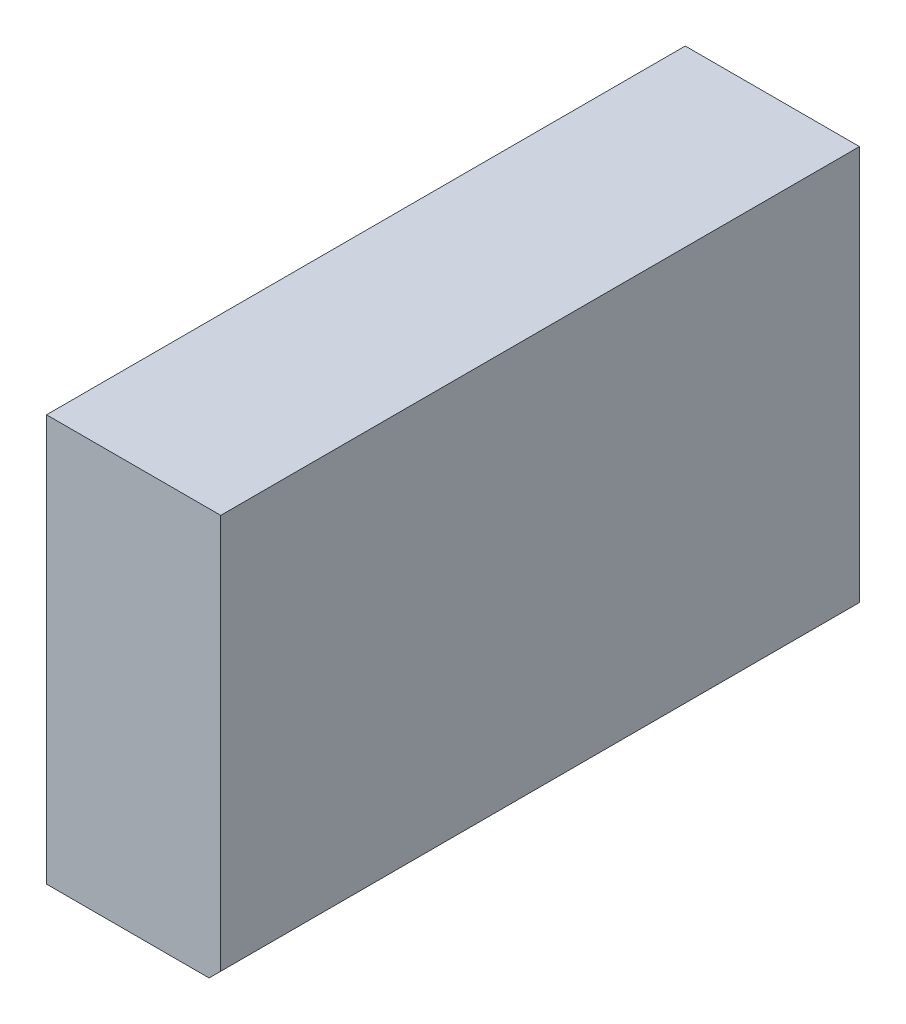
ISO-10303-21;
HEADER;
FILE_DESCRIPTION(('STEP AP214'),'2;1');
FILE_NAME('part.step','',(''),(''),'','','');
FILE_SCHEMA(('AUTOMOTIVE_DESIGN { 1 0 10303 214 1 1 1 1 }'));
ENDSEC;
DATA;
#1=APPLICATION_CONTEXT('core data for automotive mechanical design processes');
#2=APPLICATION_PROTOCOL_DEFINITION('international standard','automotive_design',2000,#1);
#3=PRODUCT_CONTEXT('',#1,'mechanical');
#4=PRODUCT('Part','Part','',(#3));
#5=PRODUCT_RELATED_PRODUCT_CATEGORY('part','',(#4));
#6=PRODUCT_DEFINITION_FORMATION('','',#4);
#7=PRODUCT_DEFINITION_CONTEXT('part definition',#1,'design');
#8=PRODUCT_DEFINITION('design','',#6,#7);
#9=PRODUCT_DEFINITION_SHAPE('','',#8);
#10=(LENGTH_UNIT() NAMED_UNIT(*) SI_UNIT(.MILLI.,.METRE.));
#11=(NAMED_UNIT(*) PLANE_ANGLE_UNIT() SI_UNIT($,.RADIAN.));
#12=(NAMED_UNIT(*) SI_UNIT($,.STERADIAN.) SOLID_ANGLE_UNIT());
#13=UNCERTAINTY_MEASURE_WITH_UNIT(LENGTH_MEASURE(1.E-05),#10,'distance_accuracy_value','');
#14=(GEOMETRIC_REPRESENTATION_CONTEXT(3) GLOBAL_UNCERTAINTY_ASSIGNED_CONTEXT((#13)) GLOBAL_UNIT_ASSIGNED_CONTEXT((#10,
#11,#12)) REPRESENTATION_CONTEXT('',''));
#15=CARTESIAN_POINT('',(0.,0.,0.));
#16=DIRECTION('',(0.,0.,1.));
#17=DIRECTION('',(1.,0.,0.));
#18=AXIS2_PLACEMENT_3D('',#15,#16,#17);
#19=CARTESIAN_POINT('',(0.,0.,139.7));
#20=DIRECTION('',(1.,0.,0.));
#21=DIRECTION('',(0.,0.,-1.));
#22=AXIS2_PLACEMENT_3D('',#19,#20,#21);
#23=PLANE('',#22);
#24=DIRECTION('',(0.,-1.,0.));
#25=VECTOR('',#24,1.);
#26=CARTESIAN_POINT('',(0.,0.,0.));
#27=LINE('',#26,#25);
#28=CARTESIAN_POINT('',(0.,88.9,0.));
#29=VERTEX_POINT('',#28);
#30=CARTESIAN_POINT('',(0.,0.,0.));
#31=VERTEX_POINT('',#30);
#32=EDGE_CURVE('E99',#29,#31,#27,.T.);
#33=ORIENTED_EDGE('',*,*,#32,.T.);
#34=DIRECTION('',(0.,0.,-1.));
#35=VECTOR('',#34,1.);
#36=CARTESIAN_POINT('',(0.,0.,139.7));
#37=LINE('',#36,#35);
#38=CARTESIAN_POINT('',(0.,0.,139.7));
#39=VERTEX_POINT('',#38);
#40=EDGE_CURVE('E82',#39,#31,#37,.T.);
#41=ORIENTED_EDGE('',*,*,#40,.F.);
#42=DIRECTION('',(0.,-1.,0.));
#43=VECTOR('',#42,1.);
#44=CARTESIAN_POINT('',(0.,0.,139.7));
#45=LINE('',#44,#43);
#46=CARTESIAN_POINT('',(0.,88.9,139.7));
#47=VERTEX_POINT('',#46);
#48=EDGE_CURVE('E87',#47,#39,#45,.T.);
#49=ORIENTED_EDGE('',*,*,#48,.F.);
#50=DIRECTION('',(0.,0.,-1.));
#51=VECTOR('',#50,1.);
#52=CARTESIAN_POINT('',(0.,88.9,139.7));
#53=LINE('',#52,#51);
#54=EDGE_CURVE('E106',#47,#29,#53,.T.);
#55=ORIENTED_EDGE('',*,*,#54,.T.);
#56=EDGE_LOOP('',(#33,#41,#49,#55));
#57=FACE_BOUND('',#56,.T.);
#58=ADVANCED_FACE('F35',(#57),#23,.F.);
#59=CARTESIAN_POINT('',(0.,0.,139.7));
#60=DIRECTION('',(0.,1.,0.));
#61=DIRECTION('',(0.,0.,1.));
#62=AXIS2_PLACEMENT_3D('',#59,#60,#61);
#63=PLANE('',#62);
#64=DIRECTION('',(1.,0.,0.));
#65=VECTOR('',#64,1.);
#66=CARTESIAN_POINT('',(0.,0.,0.));
#67=LINE('',#66,#65);
#68=CARTESIAN_POINT('',(35.56,0.,0.));
#69=VERTEX_POINT('',#68);
#70=EDGE_CURVE('E114',#31,#69,#67,.T.);
#71=ORIENTED_EDGE('',*,*,#70,.T.);
#72=DIRECTION('',(0.,0.,1.));
#73=VECTOR('',#72,1.);
#74=CARTESIAN_POINT('',(35.56,0.,139.7));
#75=LINE('',#74,#73);
#76=CARTESIAN_POINT('',(35.56,0.,139.7));
#77=VERTEX_POINT('',#76);
#78=EDGE_CURVE('E43',#69,#77,#75,.T.);
#79=ORIENTED_EDGE('',*,*,#78,.T.);
#80=DIRECTION('',(1.,0.,0.));
#81=VECTOR('',#80,1.);
#82=CARTESIAN_POINT('',(0.,0.,139.7));
#83=LINE('',#82,#81);
#84=EDGE_CURVE('E78',#39,#77,#83,.T.);
#85=ORIENTED_EDGE('',*,*,#84,.F.);
#86=ORIENTED_EDGE('',*,*,#40,.T.);
#87=EDGE_LOOP('',(#71,#79,#85,#86));
#88=FACE_BOUND('',#87,.T.);
#89=ADVANCED_FACE('F80',(#88),#63,.F.);
#90=CARTESIAN_POINT('',(38.1,0.,139.7));
#91=DIRECTION('',(-1.,0.,0.));
#92=DIRECTION('',(0.,0.,1.));
#93=AXIS2_PLACEMENT_3D('',#90,#91,#92);
#94=PLANE('',#93);
#95=DIRECTION('',(0.,1.,0.));
#96=VECTOR('',#95,1.);
#97=CARTESIAN_POINT('',(38.1,0.,139.7));
#98=LINE('',#97,#96);
#99=CARTESIAN_POINT('',(38.1,2.53999999999997,139.7));
#100=VERTEX_POINT('',#99);
#101=CARTESIAN_POINT('',(38.1,88.9,139.7));
#102=VERTEX_POINT('',#101);
#103=EDGE_CURVE('E86',#100,#102,#98,.T.);
#104=ORIENTED_EDGE('',*,*,#103,.F.);
#105=DIRECTION('',(0.,0.,-1.));
#106=VECTOR('',#105,1.);
#107=CARTESIAN_POINT('',(38.1,2.53999999999997,139.7));
#108=LINE('',#107,#106);
#109=CARTESIAN_POINT('',(38.1,2.53999999999997,0.));
#110=VERTEX_POINT('',#109);
#111=EDGE_CURVE('E100',#100,#110,#108,.T.);
#112=ORIENTED_EDGE('',*,*,#111,.T.);
#113=DIRECTION('',(0.,1.,0.));
#114=VECTOR('',#113,1.);
#115=CARTESIAN_POINT('',(38.1,0.,0.));
#116=LINE('',#115,#114);
#117=CARTESIAN_POINT('',(38.1,88.9,0.));
#118=VERTEX_POINT('',#117);
#119=EDGE_CURVE('E112',#110,#118,#116,.T.);
#120=ORIENTED_EDGE('',*,*,#119,.T.);
#121=DIRECTION('',(0.,0.,-1.));
#122=VECTOR('',#121,1.);
#123=CARTESIAN_POINT('',(38.1,88.9,139.7));
#124=LINE('',#123,#122);
#125=EDGE_CURVE('E101',#102,#118,#124,.T.);
#126=ORIENTED_EDGE('',*,*,#125,.F.);
#127=EDGE_LOOP('',(#104,#112,#120,#126));
#128=FACE_BOUND('',#127,.T.);
#129=ADVANCED_FACE('F122',(#128),#94,.F.);
#130=CARTESIAN_POINT('',(0.,88.9,139.7));
#131=DIRECTION('',(0.,-1.,0.));
#132=DIRECTION('',(0.,0.,-1.));
#133=AXIS2_PLACEMENT_3D('',#130,#131,#132);
#134=PLANE('',#133);
#135=DIRECTION('',(-1.,0.,0.));
#136=VECTOR('',#135,1.);
#137=CARTESIAN_POINT('',(0.,88.9,0.));
#138=LINE('',#137,#136);
#139=EDGE_CURVE('E96',#118,#29,#138,.T.);
#140=ORIENTED_EDGE('',*,*,#139,.T.);
#141=ORIENTED_EDGE('',*,*,#54,.F.);
#142=DIRECTION('',(-1.,0.,0.));
#143=VECTOR('',#142,1.);
#144=CARTESIAN_POINT('',(0.,88.9,139.7));
#145=LINE('',#144,#143);
#146=EDGE_CURVE('E92',#102,#47,#145,.T.);
#147=ORIENTED_EDGE('',*,*,#146,.F.);
#148=ORIENTED_EDGE('',*,*,#125,.T.);
#149=EDGE_LOOP('',(#140,#141,#147,#148));
#150=FACE_BOUND('',#149,.T.);
#151=ADVANCED_FACE('F125',(#150),#134,.F.);
#152=CARTESIAN_POINT('',(0.,0.,139.7));
#153=DIRECTION('',(0.,0.,-1.));
#154=DIRECTION('',(-1.,0.,0.));
#155=AXIS2_PLACEMENT_3D('',#152,#153,#154);
#156=PLANE('',#155);
#157=ORIENTED_EDGE('',*,*,#84,.T.);
#158=DIRECTION('',(-0.707106781186551,-0.707106781186544,0.));
#159=VECTOR('',#158,1.);
#160=CARTESIAN_POINT('',(38.1,2.53999999999997,139.7));
#161=LINE('',#160,#159);
#162=EDGE_CURVE('E11',#77,#100,#161,.F.);
#163=ORIENTED_EDGE('',*,*,#162,.T.);
#164=ORIENTED_EDGE('',*,*,#103,.T.);
#165=ORIENTED_EDGE('',*,*,#146,.T.);
#166=ORIENTED_EDGE('',*,*,#48,.T.);
#167=EDGE_LOOP('',(#157,#163,#164,#165,#166));
#168=FACE_BOUND('',#167,.T.);
#169=ADVANCED_FACE('F90',(#168),#156,.F.);
#170=CARTESIAN_POINT('',(0.,0.,0.));
#171=DIRECTION('',(0.,0.,-1.));
#172=DIRECTION('',(-1.,0.,0.));
#173=AXIS2_PLACEMENT_3D('',#170,#171,#172);
#174=PLANE('',#173);
#175=ORIENTED_EDGE('',*,*,#119,.F.);
#176=DIRECTION('',(0.707106781186551,0.707106781186544,0.));
#177=VECTOR('',#176,1.);
#178=CARTESIAN_POINT('',(17.7799999999998,-17.78,0.));
#179=LINE('',#178,#177);
#180=EDGE_CURVE('E57',#110,#69,#179,.F.);
#181=ORIENTED_EDGE('',*,*,#180,.T.);
#182=ORIENTED_EDGE('',*,*,#70,.F.);
#183=ORIENTED_EDGE('',*,*,#32,.F.);
#184=ORIENTED_EDGE('',*,*,#139,.F.);
#185=EDGE_LOOP('',(#175,#181,#182,#183,#184));
#186=FACE_BOUND('',#185,.T.);
#187=ADVANCED_FACE('F126',(#186),#174,.T.);
#188=CARTESIAN_POINT('',(38.1,2.53999999999997,139.7));
#189=DIRECTION('',(-0.707106781186544,0.707106781186551,0.));
#190=DIRECTION('',(0.,0.,-1.));
#191=AXIS2_PLACEMENT_3D('',#188,#189,#190);
#192=PLANE('',#191);
#193=ORIENTED_EDGE('',*,*,#162,.F.);
#194=ORIENTED_EDGE('',*,*,#78,.F.);
#195=ORIENTED_EDGE('',*,*,#180,.F.);
#196=ORIENTED_EDGE('',*,*,#111,.F.);
#197=EDGE_LOOP('',(#193,#194,#195,#196));
#198=FACE_BOUND('',#197,.T.);
#199=ADVANCED_FACE('F37',(#198),#192,.F.);
#200=CLOSED_SHELL('',(#58,#89,#129,#151,#169,#187,#199));
#201=MANIFOLD_SOLID_BREP('B2',#200);
#202=ADVANCED_BREP_SHAPE_REPRESENTATION('',(#18,#201),#14);
#203=SHAPE_DEFINITION_REPRESENTATION(#9,#202);
ENDSEC;
END-ISO-10303-21;
